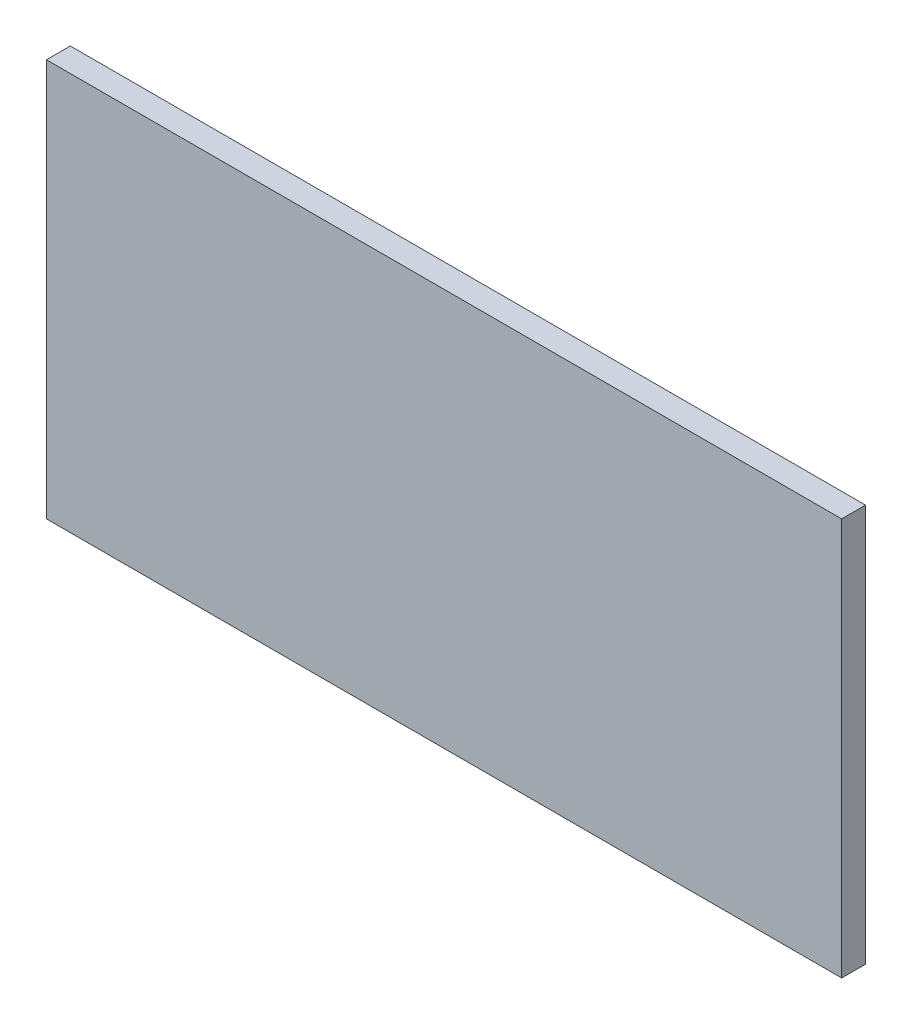
ISO-10303-21;
HEADER;
FILE_DESCRIPTION(('STEP AP214'),'2;1');
FILE_NAME('part.step','',(''),(''),'','','');
FILE_SCHEMA(('AUTOMOTIVE_DESIGN { 1 0 10303 214 1 1 1 1 }'));
ENDSEC;
DATA;
#1=APPLICATION_CONTEXT('core data for automotive mechanical design processes');
#2=APPLICATION_PROTOCOL_DEFINITION('international standard','automotive_design',2000,#1);
#3=PRODUCT_CONTEXT('',#1,'mechanical');
#4=PRODUCT('Part','Part','',(#3));
#5=PRODUCT_RELATED_PRODUCT_CATEGORY('part','',(#4));
#6=PRODUCT_DEFINITION_FORMATION('','',#4);
#7=PRODUCT_DEFINITION_CONTEXT('part definition',#1,'design');
#8=PRODUCT_DEFINITION('design','',#6,#7);
#9=PRODUCT_DEFINITION_SHAPE('','',#8);
#10=(LENGTH_UNIT() NAMED_UNIT(*) SI_UNIT(.MILLI.,.METRE.));
#11=(NAMED_UNIT(*) PLANE_ANGLE_UNIT() SI_UNIT($,.RADIAN.));
#12=(NAMED_UNIT(*) SI_UNIT($,.STERADIAN.) SOLID_ANGLE_UNIT());
#13=UNCERTAINTY_MEASURE_WITH_UNIT(LENGTH_MEASURE(1.E-05),#10,'distance_accuracy_value','');
#14=(GEOMETRIC_REPRESENTATION_CONTEXT(3) GLOBAL_UNCERTAINTY_ASSIGNED_CONTEXT((#13)) GLOBAL_UNIT_ASSIGNED_CONTEXT((#10,
#11,#12)) REPRESENTATION_CONTEXT('',''));
#15=CARTESIAN_POINT('',(0.,0.,0.));
#16=DIRECTION('',(0.,0.,1.));
#17=DIRECTION('',(1.,0.,0.));
#18=AXIS2_PLACEMENT_3D('',#15,#16,#17);
#19=CARTESIAN_POINT('',(0.,0.,6.));
#20=DIRECTION('',(-1.,0.,0.));
#21=DIRECTION('',(0.,0.,1.));
#22=AXIS2_PLACEMENT_3D('',#19,#20,#21);
#23=PLANE('',#22);
#24=DIRECTION('',(0.,1.,0.));
#25=VECTOR('',#24,1.);
#26=CARTESIAN_POINT('',(0.,0.,0.));
#27=LINE('',#26,#25);
#28=CARTESIAN_POINT('',(0.,0.,0.));
#29=VERTEX_POINT('',#28);
#30=CARTESIAN_POINT('',(0.,100.,0.));
#31=VERTEX_POINT('',#30);
#32=EDGE_CURVE('E116',#29,#31,#27,.T.);
#33=ORIENTED_EDGE('',*,*,#32,.F.);
#34=DIRECTION('',(0.,0.,-1.));
#35=VECTOR('',#34,1.);
#36=CARTESIAN_POINT('',(0.,0.,6.));
#37=LINE('',#36,#35);
#38=CARTESIAN_POINT('',(0.,0.,6.));
#39=VERTEX_POINT('',#38);
#40=EDGE_CURVE('E11',#39,#29,#37,.T.);
#41=ORIENTED_EDGE('',*,*,#40,.F.);
#42=DIRECTION('',(0.,1.,0.));
#43=VECTOR('',#42,1.);
#44=CARTESIAN_POINT('',(0.,0.,6.));
#45=LINE('',#44,#43);
#46=CARTESIAN_POINT('',(0.,100.,6.));
#47=VERTEX_POINT('',#46);
#48=EDGE_CURVE('E109',#39,#47,#45,.T.);
#49=ORIENTED_EDGE('',*,*,#48,.T.);
#50=DIRECTION('',(0.,0.,-1.));
#51=VECTOR('',#50,1.);
#52=CARTESIAN_POINT('',(0.,100.,6.));
#53=LINE('',#52,#51);
#54=EDGE_CURVE('E48',#47,#31,#53,.T.);
#55=ORIENTED_EDGE('',*,*,#54,.T.);
#56=EDGE_LOOP('',(#33,#41,#49,#55));
#57=FACE_BOUND('',#56,.T.);
#58=ADVANCED_FACE('F45',(#57),#23,.T.);
#59=CARTESIAN_POINT('',(0.,0.,6.));
#60=DIRECTION('',(0.,1.,0.));
#61=DIRECTION('',(0.,0.,1.));
#62=AXIS2_PLACEMENT_3D('',#59,#60,#61);
#63=PLANE('',#62);
#64=DIRECTION('',(1.,0.,0.));
#65=VECTOR('',#64,1.);
#66=CARTESIAN_POINT('',(0.,0.,0.));
#67=LINE('',#66,#65);
#68=CARTESIAN_POINT('',(200.,0.,0.));
#69=VERTEX_POINT('',#68);
#70=EDGE_CURVE('E79',#29,#69,#67,.T.);
#71=ORIENTED_EDGE('',*,*,#70,.T.);
#72=DIRECTION('',(0.,0.,-1.));
#73=VECTOR('',#72,1.);
#74=CARTESIAN_POINT('',(200.,0.,6.));
#75=LINE('',#74,#73);
#76=CARTESIAN_POINT('',(200.,0.,6.));
#77=VERTEX_POINT('',#76);
#78=EDGE_CURVE('E55',#77,#69,#75,.T.);
#79=ORIENTED_EDGE('',*,*,#78,.F.);
#80=DIRECTION('',(1.,0.,0.));
#81=VECTOR('',#80,1.);
#82=CARTESIAN_POINT('',(0.,0.,6.));
#83=LINE('',#82,#81);
#84=EDGE_CURVE('E96',#39,#77,#83,.T.);
#85=ORIENTED_EDGE('',*,*,#84,.F.);
#86=ORIENTED_EDGE('',*,*,#40,.T.);
#87=EDGE_LOOP('',(#71,#79,#85,#86));
#88=FACE_BOUND('',#87,.T.);
#89=ADVANCED_FACE('F132',(#88),#63,.F.);
#90=CARTESIAN_POINT('',(200.,0.,6.));
#91=DIRECTION('',(-1.,0.,0.));
#92=DIRECTION('',(0.,0.,1.));
#93=AXIS2_PLACEMENT_3D('',#90,#91,#92);
#94=PLANE('',#93);
#95=DIRECTION('',(0.,1.,0.));
#96=VECTOR('',#95,1.);
#97=CARTESIAN_POINT('',(200.,0.,0.));
#98=LINE('',#97,#96);
#99=CARTESIAN_POINT('',(200.,100.,0.));
#100=VERTEX_POINT('',#99);
#101=EDGE_CURVE('E104',#69,#100,#98,.T.);
#102=ORIENTED_EDGE('',*,*,#101,.T.);
#103=DIRECTION('',(0.,0.,-1.));
#104=VECTOR('',#103,1.);
#105=CARTESIAN_POINT('',(200.,100.,6.));
#106=LINE('',#105,#104);
#107=CARTESIAN_POINT('',(200.,100.,6.));
#108=VERTEX_POINT('',#107);
#109=EDGE_CURVE('E101',#108,#100,#106,.T.);
#110=ORIENTED_EDGE('',*,*,#109,.F.);
#111=DIRECTION('',(0.,1.,0.));
#112=VECTOR('',#111,1.);
#113=CARTESIAN_POINT('',(200.,0.,6.));
#114=LINE('',#113,#112);
#115=EDGE_CURVE('E91',#77,#108,#114,.T.);
#116=ORIENTED_EDGE('',*,*,#115,.F.);
#117=ORIENTED_EDGE('',*,*,#78,.T.);
#118=EDGE_LOOP('',(#102,#110,#116,#117));
#119=FACE_BOUND('',#118,.T.);
#120=ADVANCED_FACE('F102',(#119),#94,.F.);
#121=CARTESIAN_POINT('',(0.,100.,6.));
#122=DIRECTION('',(0.,1.,0.));
#123=DIRECTION('',(0.,0.,1.));
#124=AXIS2_PLACEMENT_3D('',#121,#122,#123);
#125=PLANE('',#124);
#126=DIRECTION('',(1.,0.,0.));
#127=VECTOR('',#126,1.);
#128=CARTESIAN_POINT('',(0.,100.,0.));
#129=LINE('',#128,#127);
#130=EDGE_CURVE('E120',#31,#100,#129,.T.);
#131=ORIENTED_EDGE('',*,*,#130,.F.);
#132=ORIENTED_EDGE('',*,*,#54,.F.);
#133=DIRECTION('',(1.,0.,0.));
#134=VECTOR('',#133,1.);
#135=CARTESIAN_POINT('',(0.,100.,6.));
#136=LINE('',#135,#134);
#137=EDGE_CURVE('E95',#47,#108,#136,.T.);
#138=ORIENTED_EDGE('',*,*,#137,.T.);
#139=ORIENTED_EDGE('',*,*,#109,.T.);
#140=EDGE_LOOP('',(#131,#132,#138,#139));
#141=FACE_BOUND('',#140,.T.);
#142=ADVANCED_FACE('F107',(#141),#125,.T.);
#143=CARTESIAN_POINT('',(0.,0.,6.));
#144=DIRECTION('',(0.,0.,-1.));
#145=DIRECTION('',(-1.,0.,0.));
#146=AXIS2_PLACEMENT_3D('',#143,#144,#145);
#147=PLANE('',#146);
#148=ORIENTED_EDGE('',*,*,#48,.F.);
#149=ORIENTED_EDGE('',*,*,#84,.T.);
#150=ORIENTED_EDGE('',*,*,#115,.T.);
#151=ORIENTED_EDGE('',*,*,#137,.F.);
#152=EDGE_LOOP('',(#148,#149,#150,#151));
#153=FACE_BOUND('',#152,.T.);
#154=ADVANCED_FACE('F94',(#153),#147,.F.);
#155=CARTESIAN_POINT('',(0.,0.,0.));
#156=DIRECTION('',(0.,0.,-1.));
#157=DIRECTION('',(-1.,0.,0.));
#158=AXIS2_PLACEMENT_3D('',#155,#156,#157);
#159=PLANE('',#158);
#160=ORIENTED_EDGE('',*,*,#32,.T.);
#161=ORIENTED_EDGE('',*,*,#130,.T.);
#162=ORIENTED_EDGE('',*,*,#101,.F.);
#163=ORIENTED_EDGE('',*,*,#70,.F.);
#164=EDGE_LOOP('',(#160,#161,#162,#163));
#165=FACE_BOUND('',#164,.T.);
#166=ADVANCED_FACE('F129',(#165),#159,.T.);
#167=CLOSED_SHELL('',(#58,#89,#120,#142,#154,#166));
#168=MANIFOLD_SOLID_BREP('B2',#167);
#169=ADVANCED_BREP_SHAPE_REPRESENTATION('',(#18,#168),#14);
#170=SHAPE_DEFINITION_REPRESENTATION(#9,#169);
ENDSEC;
END-ISO-10303-21;
